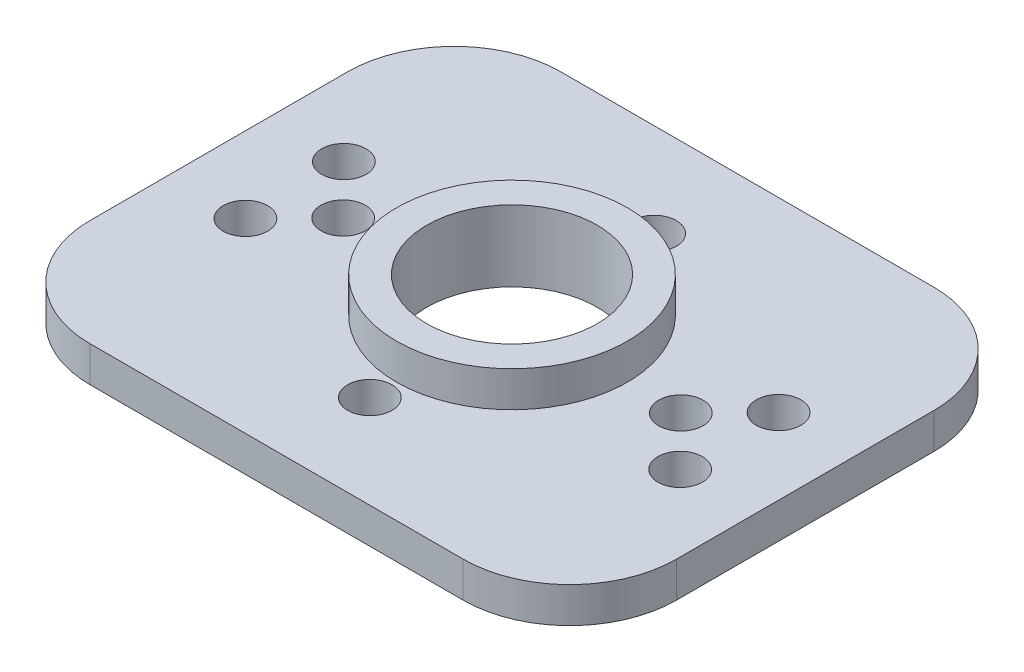
ISO-10303-21;
HEADER;
FILE_DESCRIPTION(('STEP AP214'),'2;1');
FILE_NAME('part.step','',(''),(''),'','','');
FILE_SCHEMA(('AUTOMOTIVE_DESIGN { 1 0 10303 214 1 1 1 1 }'));
ENDSEC;
DATA;
#1=APPLICATION_CONTEXT('core data for automotive mechanical design processes');
#2=APPLICATION_PROTOCOL_DEFINITION('international standard','automotive_design',2000,#1);
#3=PRODUCT_CONTEXT('',#1,'mechanical');
#4=PRODUCT('Part','Part','',(#3));
#5=PRODUCT_RELATED_PRODUCT_CATEGORY('part','',(#4));
#6=PRODUCT_DEFINITION_FORMATION('','',#4);
#7=PRODUCT_DEFINITION_CONTEXT('part definition',#1,'design');
#8=PRODUCT_DEFINITION('design','',#6,#7);
#9=PRODUCT_DEFINITION_SHAPE('','',#8);
#10=(LENGTH_UNIT() NAMED_UNIT(*) SI_UNIT(.MILLI.,.METRE.));
#11=(NAMED_UNIT(*) PLANE_ANGLE_UNIT() SI_UNIT($,.RADIAN.));
#12=(NAMED_UNIT(*) SI_UNIT($,.STERADIAN.) SOLID_ANGLE_UNIT());
#13=UNCERTAINTY_MEASURE_WITH_UNIT(LENGTH_MEASURE(1.E-05),#10,'distance_accuracy_value','');
#14=(GEOMETRIC_REPRESENTATION_CONTEXT(3) GLOBAL_UNCERTAINTY_ASSIGNED_CONTEXT((#13)) GLOBAL_UNIT_ASSIGNED_CONTEXT((#10,
#11,#12)) REPRESENTATION_CONTEXT('',''));
#15=CARTESIAN_POINT('',(0.,0.,0.));
#16=DIRECTION('',(0.,0.,1.));
#17=DIRECTION('',(1.,0.,0.));
#18=AXIS2_PLACEMENT_3D('',#15,#16,#17);
#19=CARTESIAN_POINT('',(-10.5,2.,7.24703162232863));
#20=DIRECTION('',(0.,-1.,0.));
#21=DIRECTION('',(0.,0.,-1.));
#22=AXIS2_PLACEMENT_3D('',#19,#20,#21);
#23=PLANE('',#22);
#24=CARTESIAN_POINT('',(12.23,2.,-2.77));
#25=DIRECTION('',(0.,1.,0.));
#26=DIRECTION('',(0.,0.,1.));
#27=AXIS2_PLACEMENT_3D('',#24,#25,#26);
#28=CIRCLE('',#27,1.25);
#29=CARTESIAN_POINT('',(12.23,2.,-1.52));
#30=VERTEX_POINT('',#29);
#31=EDGE_CURVE('E357',#30,#30,#28,.T.);
#32=ORIENTED_EDGE('',*,*,#31,.F.);
#33=EDGE_LOOP('',(#32));
#34=FACE_BOUND('',#33,.T.);
#35=CARTESIAN_POINT('',(12.23,2.,2.77));
#36=DIRECTION('',(0.,1.,0.));
#37=DIRECTION('',(0.,0.,1.));
#38=AXIS2_PLACEMENT_3D('',#35,#36,#37);
#39=CIRCLE('',#38,1.25);
#40=CARTESIAN_POINT('',(12.23,2.,4.02));
#41=VERTEX_POINT('',#40);
#42=EDGE_CURVE('E351',#41,#41,#39,.T.);
#43=ORIENTED_EDGE('',*,*,#42,.F.);
#44=EDGE_LOOP('',(#43));
#45=FACE_BOUND('',#44,.T.);
#46=CARTESIAN_POINT('',(-12.23,2.,2.77));
#47=DIRECTION('',(0.,1.,0.));
#48=DIRECTION('',(0.,0.,1.));
#49=AXIS2_PLACEMENT_3D('',#46,#47,#48);
#50=CIRCLE('',#49,1.25);
#51=CARTESIAN_POINT('',(-12.23,2.,4.02));
#52=VERTEX_POINT('',#51);
#53=EDGE_CURVE('E348',#52,#52,#50,.T.);
#54=ORIENTED_EDGE('',*,*,#53,.F.);
#55=EDGE_LOOP('',(#54));
#56=FACE_BOUND('',#55,.T.);
#57=CARTESIAN_POINT('',(-12.23,2.,-2.77));
#58=DIRECTION('',(0.,1.,0.));
#59=DIRECTION('',(0.,0.,1.));
#60=AXIS2_PLACEMENT_3D('',#57,#58,#59);
#61=CIRCLE('',#60,1.25);
#62=CARTESIAN_POINT('',(-12.23,2.,-1.52));
#63=VERTEX_POINT('',#62);
#64=EDGE_CURVE('E195',#63,#63,#61,.T.);
#65=ORIENTED_EDGE('',*,*,#64,.F.);
#66=EDGE_LOOP('',(#65));
#67=FACE_BOUND('',#66,.T.);
#68=CARTESIAN_POINT('',(9.5,2.,0.));
#69=DIRECTION('',(0.,1.,0.));
#70=DIRECTION('',(0.,0.,1.));
#71=AXIS2_PLACEMENT_3D('',#68,#69,#70);
#72=CIRCLE('',#71,1.25);
#73=CARTESIAN_POINT('',(9.5,2.,1.25));
#74=VERTEX_POINT('',#73);
#75=EDGE_CURVE('E225',#74,#74,#72,.T.);
#76=ORIENTED_EDGE('',*,*,#75,.F.);
#77=EDGE_LOOP('',(#76));
#78=FACE_BOUND('',#77,.T.);
#79=CARTESIAN_POINT('',(-9.5,2.,0.));
#80=DIRECTION('',(0.,1.,0.));
#81=DIRECTION('',(0.,0.,1.));
#82=AXIS2_PLACEMENT_3D('',#79,#80,#81);
#83=CIRCLE('',#82,1.25);
#84=CARTESIAN_POINT('',(-9.5,2.,1.25));
#85=VERTEX_POINT('',#84);
#86=EDGE_CURVE('E233',#85,#85,#83,.T.);
#87=ORIENTED_EDGE('',*,*,#86,.F.);
#88=EDGE_LOOP('',(#87));
#89=FACE_BOUND('',#88,.T.);
#90=CARTESIAN_POINT('',(0.,2.,8.));
#91=DIRECTION('',(0.,1.,0.));
#92=DIRECTION('',(0.,0.,1.));
#93=AXIS2_PLACEMENT_3D('',#90,#91,#92);
#94=CIRCLE('',#93,1.25);
#95=CARTESIAN_POINT('',(0.,2.,9.25));
#96=VERTEX_POINT('',#95);
#97=EDGE_CURVE('E241',#96,#96,#94,.T.);
#98=ORIENTED_EDGE('',*,*,#97,.F.);
#99=EDGE_LOOP('',(#98));
#100=FACE_BOUND('',#99,.T.);
#101=CARTESIAN_POINT('',(0.,2.,-8.));
#102=DIRECTION('',(0.,1.,0.));
#103=DIRECTION('',(0.,0.,1.));
#104=AXIS2_PLACEMENT_3D('',#101,#102,#103);
#105=CIRCLE('',#104,1.25);
#106=CARTESIAN_POINT('',(0.,2.,-6.75));
#107=VERTEX_POINT('',#106);
#108=EDGE_CURVE('E151',#107,#107,#105,.T.);
#109=ORIENTED_EDGE('',*,*,#108,.F.);
#110=EDGE_LOOP('',(#109));
#111=FACE_BOUND('',#110,.T.);
#112=CARTESIAN_POINT('',(-10.5,2.,7.24703162232863));
#113=DIRECTION('',(0.,1.,0.));
#114=DIRECTION('',(0.,0.,-1.));
#115=AXIS2_PLACEMENT_3D('',#112,#113,#114);
#116=CIRCLE('',#115,6.);
#117=CARTESIAN_POINT('',(-16.5,2.,7.24703162232859));
#118=VERTEX_POINT('',#117);
#119=CARTESIAN_POINT('',(-10.5,2.,13.2470316223286));
#120=VERTEX_POINT('',#119);
#121=EDGE_CURVE('E169',#118,#120,#116,.T.);
#122=ORIENTED_EDGE('',*,*,#121,.T.);
#123=DIRECTION('',(1.,0.,0.));
#124=VECTOR('',#123,1.);
#125=CARTESIAN_POINT('',(10.5,2.,13.2470316223286));
#126=LINE('',#125,#124);
#127=CARTESIAN_POINT('',(10.5,2.,13.2470316223286));
#128=VERTEX_POINT('',#127);
#129=EDGE_CURVE('E105',#120,#128,#126,.T.);
#130=ORIENTED_EDGE('',*,*,#129,.T.);
#131=CARTESIAN_POINT('',(10.5,2.,7.24703162232863));
#132=DIRECTION('',(0.,1.,0.));
#133=DIRECTION('',(0.,0.,1.));
#134=AXIS2_PLACEMENT_3D('',#131,#132,#133);
#135=CIRCLE('',#134,6.);
#136=CARTESIAN_POINT('',(16.5,2.,7.24703162232859));
#137=VERTEX_POINT('',#136);
#138=EDGE_CURVE('E259',#128,#137,#135,.T.);
#139=ORIENTED_EDGE('',*,*,#138,.T.);
#140=DIRECTION('',(0.,0.,-1.));
#141=VECTOR('',#140,1.);
#142=CARTESIAN_POINT('',(16.5,2.,7.24703162232859));
#143=LINE('',#142,#141);
#144=CARTESIAN_POINT('',(16.5,2.,-7.24703162232859));
#145=VERTEX_POINT('',#144);
#146=EDGE_CURVE('E262',#137,#145,#143,.T.);
#147=ORIENTED_EDGE('',*,*,#146,.T.);
#148=CARTESIAN_POINT('',(10.5,2.,-7.24703162232863));
#149=DIRECTION('',(0.,1.,0.));
#150=DIRECTION('',(0.,0.,-1.));
#151=AXIS2_PLACEMENT_3D('',#148,#149,#150);
#152=CIRCLE('',#151,6.);
#153=CARTESIAN_POINT('',(10.5,2.,-13.2470316223286));
#154=VERTEX_POINT('',#153);
#155=EDGE_CURVE('E124',#145,#154,#152,.T.);
#156=ORIENTED_EDGE('',*,*,#155,.T.);
#157=DIRECTION('',(-1.,0.,0.));
#158=VECTOR('',#157,1.);
#159=CARTESIAN_POINT('',(10.5,2.,-13.2470316223286));
#160=LINE('',#159,#158);
#161=CARTESIAN_POINT('',(-10.5,2.,-13.2470316223286));
#162=VERTEX_POINT('',#161);
#163=EDGE_CURVE('E118',#154,#162,#160,.T.);
#164=ORIENTED_EDGE('',*,*,#163,.T.);
#165=CARTESIAN_POINT('',(-10.5,2.,-7.24703162232863));
#166=DIRECTION('',(0.,1.,0.));
#167=DIRECTION('',(0.,0.,-1.));
#168=AXIS2_PLACEMENT_3D('',#165,#166,#167);
#169=CIRCLE('',#168,6.);
#170=CARTESIAN_POINT('',(-16.5,2.,-7.24703162232858));
#171=VERTEX_POINT('',#170);
#172=EDGE_CURVE('E122',#162,#171,#169,.T.);
#173=ORIENTED_EDGE('',*,*,#172,.T.);
#174=DIRECTION('',(0.,0.,1.));
#175=VECTOR('',#174,1.);
#176=CARTESIAN_POINT('',(-16.5,2.,7.24703162232859));
#177=LINE('',#176,#175);
#178=EDGE_CURVE('E61',#171,#118,#177,.T.);
#179=ORIENTED_EDGE('',*,*,#178,.T.);
#180=EDGE_LOOP('',(#122,#130,#139,#147,#156,#164,#173,#179));
#181=FACE_BOUND('',#180,.T.);
#182=CARTESIAN_POINT('',(0.,2.,0.));
#183=DIRECTION('',(0.,-1.,0.));
#184=DIRECTION('',(0.,0.,-1.));
#185=AXIS2_PLACEMENT_3D('',#182,#183,#184);
#186=CIRCLE('',#185,6.5);
#187=CARTESIAN_POINT('',(0.,2.,-6.5));
#188=VERTEX_POINT('',#187);
#189=EDGE_CURVE('E11',#188,#188,#186,.F.);
#190=ORIENTED_EDGE('',*,*,#189,.F.);
#191=EDGE_LOOP('',(#190));
#192=FACE_BOUND('',#191,.T.);
#193=ADVANCED_FACE('F41',(#34,#45,#56,#67,#78,#89,#100,#111,#181,#192),#23,.F.);
#194=CARTESIAN_POINT('',(-10.5,0.,7.24703162232863));
#195=DIRECTION('',(0.,-1.,0.));
#196=DIRECTION('',(0.,0.,-1.));
#197=AXIS2_PLACEMENT_3D('',#194,#195,#196);
#198=PLANE('',#197);
#199=CARTESIAN_POINT('',(12.23,0.,-2.77));
#200=DIRECTION('',(0.,-1.,0.));
#201=DIRECTION('',(0.,0.,-1.));
#202=AXIS2_PLACEMENT_3D('',#199,#200,#201);
#203=CIRCLE('',#202,1.25);
#204=CARTESIAN_POINT('',(12.23,0.,-4.02));
#205=VERTEX_POINT('',#204);
#206=EDGE_CURVE('E45',#205,#205,#203,.T.);
#207=ORIENTED_EDGE('',*,*,#206,.F.);
#208=EDGE_LOOP('',(#207));
#209=FACE_BOUND('',#208,.T.);
#210=CARTESIAN_POINT('',(12.23,0.,2.77));
#211=DIRECTION('',(0.,-1.,0.));
#212=DIRECTION('',(0.,0.,-1.));
#213=AXIS2_PLACEMENT_3D('',#210,#211,#212);
#214=CIRCLE('',#213,1.25);
#215=CARTESIAN_POINT('',(12.23,0.,1.52));
#216=VERTEX_POINT('',#215);
#217=EDGE_CURVE('E198',#216,#216,#214,.T.);
#218=ORIENTED_EDGE('',*,*,#217,.F.);
#219=EDGE_LOOP('',(#218));
#220=FACE_BOUND('',#219,.T.);
#221=CARTESIAN_POINT('',(-12.23,0.,2.77));
#222=DIRECTION('',(0.,-1.,0.));
#223=DIRECTION('',(0.,0.,-1.));
#224=AXIS2_PLACEMENT_3D('',#221,#222,#223);
#225=CIRCLE('',#224,1.25);
#226=CARTESIAN_POINT('',(-12.23,0.,1.52));
#227=VERTEX_POINT('',#226);
#228=EDGE_CURVE('E194',#227,#227,#225,.T.);
#229=ORIENTED_EDGE('',*,*,#228,.F.);
#230=EDGE_LOOP('',(#229));
#231=FACE_BOUND('',#230,.T.);
#232=CARTESIAN_POINT('',(-12.23,0.,-2.77));
#233=DIRECTION('',(0.,-1.,0.));
#234=DIRECTION('',(0.,0.,-1.));
#235=AXIS2_PLACEMENT_3D('',#232,#233,#234);
#236=CIRCLE('',#235,1.25);
#237=CARTESIAN_POINT('',(-12.23,0.,-4.02));
#238=VERTEX_POINT('',#237);
#239=EDGE_CURVE('E190',#238,#238,#236,.T.);
#240=ORIENTED_EDGE('',*,*,#239,.F.);
#241=EDGE_LOOP('',(#240));
#242=FACE_BOUND('',#241,.T.);
#243=CARTESIAN_POINT('',(9.5,0.,0.));
#244=DIRECTION('',(0.,1.,0.));
#245=DIRECTION('',(0.,0.,1.));
#246=AXIS2_PLACEMENT_3D('',#243,#244,#245);
#247=CIRCLE('',#246,1.25);
#248=CARTESIAN_POINT('',(9.5,0.,1.25));
#249=VERTEX_POINT('',#248);
#250=EDGE_CURVE('E224',#249,#249,#247,.T.);
#251=ORIENTED_EDGE('',*,*,#250,.T.);
#252=EDGE_LOOP('',(#251));
#253=FACE_BOUND('',#252,.T.);
#254=CARTESIAN_POINT('',(0.,0.,8.));
#255=DIRECTION('',(0.,1.,0.));
#256=DIRECTION('',(0.,0.,1.));
#257=AXIS2_PLACEMENT_3D('',#254,#255,#256);
#258=CIRCLE('',#257,1.25);
#259=CARTESIAN_POINT('',(0.,0.,9.25));
#260=VERTEX_POINT('',#259);
#261=EDGE_CURVE('E237',#260,#260,#258,.T.);
#262=ORIENTED_EDGE('',*,*,#261,.T.);
#263=EDGE_LOOP('',(#262));
#264=FACE_BOUND('',#263,.T.);
#265=CARTESIAN_POINT('',(-10.5,0.,7.24703162232863));
#266=DIRECTION('',(0.,1.,0.));
#267=DIRECTION('',(0.,0.,-1.));
#268=AXIS2_PLACEMENT_3D('',#265,#266,#267);
#269=CIRCLE('',#268,6.);
#270=CARTESIAN_POINT('',(-16.5,0.,7.24703162232859));
#271=VERTEX_POINT('',#270);
#272=CARTESIAN_POINT('',(-10.5,0.,13.2470316223286));
#273=VERTEX_POINT('',#272);
#274=EDGE_CURVE('E146',#271,#273,#269,.T.);
#275=ORIENTED_EDGE('',*,*,#274,.F.);
#276=DIRECTION('',(0.,0.,1.));
#277=VECTOR('',#276,1.);
#278=CARTESIAN_POINT('',(-16.5,0.,7.24703162232859));
#279=LINE('',#278,#277);
#280=CARTESIAN_POINT('',(-16.5,0.,-7.24703162232858));
#281=VERTEX_POINT('',#280);
#282=EDGE_CURVE('E96',#281,#271,#279,.T.);
#283=ORIENTED_EDGE('',*,*,#282,.F.);
#284=CARTESIAN_POINT('',(-10.5,0.,-7.24703162232863));
#285=DIRECTION('',(0.,1.,0.));
#286=DIRECTION('',(0.,0.,-1.));
#287=AXIS2_PLACEMENT_3D('',#284,#285,#286);
#288=CIRCLE('',#287,6.);
#289=CARTESIAN_POINT('',(-10.5,0.,-13.2470316223286));
#290=VERTEX_POINT('',#289);
#291=EDGE_CURVE('E90',#290,#281,#288,.T.);
#292=ORIENTED_EDGE('',*,*,#291,.F.);
#293=DIRECTION('',(-1.,0.,0.));
#294=VECTOR('',#293,1.);
#295=CARTESIAN_POINT('',(10.5,0.,-13.2470316223286));
#296=LINE('',#295,#294);
#297=CARTESIAN_POINT('',(10.5,0.,-13.2470316223286));
#298=VERTEX_POINT('',#297);
#299=EDGE_CURVE('E133',#298,#290,#296,.T.);
#300=ORIENTED_EDGE('',*,*,#299,.F.);
#301=CARTESIAN_POINT('',(10.5,0.,-7.24703162232863));
#302=DIRECTION('',(0.,1.,0.));
#303=DIRECTION('',(0.,0.,-1.));
#304=AXIS2_PLACEMENT_3D('',#301,#302,#303);
#305=CIRCLE('',#304,6.);
#306=CARTESIAN_POINT('',(16.5,0.,-7.24703162232859));
#307=VERTEX_POINT('',#306);
#308=EDGE_CURVE('E160',#307,#298,#305,.T.);
#309=ORIENTED_EDGE('',*,*,#308,.F.);
#310=DIRECTION('',(0.,0.,-1.));
#311=VECTOR('',#310,1.);
#312=CARTESIAN_POINT('',(16.5,0.,7.24703162232859));
#313=LINE('',#312,#311);
#314=CARTESIAN_POINT('',(16.5,0.,7.24703162232859));
#315=VERTEX_POINT('',#314);
#316=EDGE_CURVE('E157',#315,#307,#313,.T.);
#317=ORIENTED_EDGE('',*,*,#316,.F.);
#318=CARTESIAN_POINT('',(10.5,0.,7.24703162232863));
#319=DIRECTION('',(0.,1.,0.));
#320=DIRECTION('',(0.,0.,1.));
#321=AXIS2_PLACEMENT_3D('',#318,#319,#320);
#322=CIRCLE('',#321,6.);
#323=CARTESIAN_POINT('',(10.5,0.,13.2470316223286));
#324=VERTEX_POINT('',#323);
#325=EDGE_CURVE('E154',#324,#315,#322,.T.);
#326=ORIENTED_EDGE('',*,*,#325,.F.);
#327=DIRECTION('',(1.,0.,0.));
#328=VECTOR('',#327,1.);
#329=CARTESIAN_POINT('',(10.5,0.,13.2470316223286));
#330=LINE('',#329,#328);
#331=EDGE_CURVE('E150',#273,#324,#330,.T.);
#332=ORIENTED_EDGE('',*,*,#331,.F.);
#333=EDGE_LOOP('',(#275,#283,#292,#300,#309,#317,#326,#332));
#334=FACE_BOUND('',#333,.T.);
#335=CARTESIAN_POINT('',(0.,0.,-8.));
#336=DIRECTION('',(0.,1.,0.));
#337=DIRECTION('',(0.,0.,1.));
#338=AXIS2_PLACEMENT_3D('',#335,#336,#337);
#339=CIRCLE('',#338,1.25);
#340=CARTESIAN_POINT('',(0.,0.,-6.75));
#341=VERTEX_POINT('',#340);
#342=EDGE_CURVE('E245',#341,#341,#339,.T.);
#343=ORIENTED_EDGE('',*,*,#342,.T.);
#344=EDGE_LOOP('',(#343));
#345=FACE_BOUND('',#344,.T.);
#346=CARTESIAN_POINT('',(-9.5,0.,0.));
#347=DIRECTION('',(0.,1.,0.));
#348=DIRECTION('',(0.,0.,1.));
#349=AXIS2_PLACEMENT_3D('',#346,#347,#348);
#350=CIRCLE('',#349,1.25);
#351=CARTESIAN_POINT('',(-9.5,0.,1.25));
#352=VERTEX_POINT('',#351);
#353=EDGE_CURVE('E229',#352,#352,#350,.T.);
#354=ORIENTED_EDGE('',*,*,#353,.T.);
#355=EDGE_LOOP('',(#354));
#356=FACE_BOUND('',#355,.T.);
#357=CARTESIAN_POINT('',(0.,0.,0.));
#358=DIRECTION('',(0.,1.,0.));
#359=DIRECTION('',(0.,0.,1.));
#360=AXIS2_PLACEMENT_3D('',#357,#358,#359);
#361=CIRCLE('',#360,4.8);
#362=CARTESIAN_POINT('',(0.,0.,4.8));
#363=VERTEX_POINT('',#362);
#364=EDGE_CURVE('E216',#363,#363,#361,.T.);
#365=ORIENTED_EDGE('',*,*,#364,.T.);
#366=EDGE_LOOP('',(#365));
#367=FACE_BOUND('',#366,.T.);
#368=ADVANCED_FACE('F277',(#209,#220,#231,#242,#253,#264,#334,#345,#356,#367),#198,.T.);
#369=CARTESIAN_POINT('',(-10.5,2.,7.24703162232863));
#370=DIRECTION('',(0.,-1.,0.));
#371=DIRECTION('',(0.,0.,-1.));
#372=AXIS2_PLACEMENT_3D('',#369,#370,#371);
#373=CYLINDRICAL_SURFACE('',#372,6.);
#374=ORIENTED_EDGE('',*,*,#274,.T.);
#375=DIRECTION('',(0.,-1.,0.));
#376=VECTOR('',#375,1.);
#377=CARTESIAN_POINT('',(-10.5,2.,13.2470316223286));
#378=LINE('',#377,#376);
#379=EDGE_CURVE('E52',#120,#273,#378,.T.);
#380=ORIENTED_EDGE('',*,*,#379,.F.);
#381=ORIENTED_EDGE('',*,*,#121,.F.);
#382=DIRECTION('',(0.,-1.,0.));
#383=VECTOR('',#382,1.);
#384=CARTESIAN_POINT('',(-16.5,2.,7.24703162232859));
#385=LINE('',#384,#383);
#386=EDGE_CURVE('E142',#118,#271,#385,.T.);
#387=ORIENTED_EDGE('',*,*,#386,.T.);
#388=EDGE_LOOP('',(#374,#380,#381,#387));
#389=FACE_BOUND('',#388,.T.);
#390=ADVANCED_FACE('F43',(#389),#373,.T.);
#391=CARTESIAN_POINT('',(10.5,2.,13.2470316223286));
#392=DIRECTION('',(0.,0.,-1.));
#393=DIRECTION('',(-1.,0.,0.));
#394=AXIS2_PLACEMENT_3D('',#391,#392,#393);
#395=PLANE('',#394);
#396=ORIENTED_EDGE('',*,*,#331,.T.);
#397=DIRECTION('',(0.,-1.,0.));
#398=VECTOR('',#397,1.);
#399=CARTESIAN_POINT('',(10.5,2.,13.2470316223286));
#400=LINE('',#399,#398);
#401=EDGE_CURVE('E184',#128,#324,#400,.T.);
#402=ORIENTED_EDGE('',*,*,#401,.F.);
#403=ORIENTED_EDGE('',*,*,#129,.F.);
#404=ORIENTED_EDGE('',*,*,#379,.T.);
#405=EDGE_LOOP('',(#396,#402,#403,#404));
#406=FACE_BOUND('',#405,.T.);
#407=ADVANCED_FACE('F448',(#406),#395,.F.);
#408=CARTESIAN_POINT('',(10.5,2.,7.24703162232863));
#409=DIRECTION('',(0.,-1.,0.));
#410=DIRECTION('',(0.,0.,-1.));
#411=AXIS2_PLACEMENT_3D('',#408,#409,#410);
#412=CYLINDRICAL_SURFACE('',#411,6.);
#413=ORIENTED_EDGE('',*,*,#325,.T.);
#414=DIRECTION('',(0.,-1.,0.));
#415=VECTOR('',#414,1.);
#416=CARTESIAN_POINT('',(16.5,2.,7.24703162232859));
#417=LINE('',#416,#415);
#418=EDGE_CURVE('E180',#137,#315,#417,.T.);
#419=ORIENTED_EDGE('',*,*,#418,.F.);
#420=ORIENTED_EDGE('',*,*,#138,.F.);
#421=ORIENTED_EDGE('',*,*,#401,.T.);
#422=EDGE_LOOP('',(#413,#419,#420,#421));
#423=FACE_BOUND('',#422,.T.);
#424=ADVANCED_FACE('F453',(#423),#412,.T.);
#425=CARTESIAN_POINT('',(16.5,2.,7.24703162232859));
#426=DIRECTION('',(-1.,0.,0.));
#427=DIRECTION('',(0.,0.,1.));
#428=AXIS2_PLACEMENT_3D('',#425,#426,#427);
#429=PLANE('',#428);
#430=ORIENTED_EDGE('',*,*,#316,.T.);
#431=DIRECTION('',(0.,-1.,0.));
#432=VECTOR('',#431,1.);
#433=CARTESIAN_POINT('',(16.5,2.,-7.24703162232859));
#434=LINE('',#433,#432);
#435=EDGE_CURVE('E176',#145,#307,#434,.T.);
#436=ORIENTED_EDGE('',*,*,#435,.F.);
#437=ORIENTED_EDGE('',*,*,#146,.F.);
#438=ORIENTED_EDGE('',*,*,#418,.T.);
#439=EDGE_LOOP('',(#430,#436,#437,#438));
#440=FACE_BOUND('',#439,.T.);
#441=ADVANCED_FACE('F270',(#440),#429,.F.);
#442=CARTESIAN_POINT('',(10.5,2.,-7.24703162232863));
#443=DIRECTION('',(0.,-1.,0.));
#444=DIRECTION('',(0.,0.,-1.));
#445=AXIS2_PLACEMENT_3D('',#442,#443,#444);
#446=CYLINDRICAL_SURFACE('',#445,6.);
#447=ORIENTED_EDGE('',*,*,#308,.T.);
#448=DIRECTION('',(0.,-1.,0.));
#449=VECTOR('',#448,1.);
#450=CARTESIAN_POINT('',(10.5,2.,-13.2470316223286));
#451=LINE('',#450,#449);
#452=EDGE_CURVE('E135',#154,#298,#451,.T.);
#453=ORIENTED_EDGE('',*,*,#452,.F.);
#454=ORIENTED_EDGE('',*,*,#155,.F.);
#455=ORIENTED_EDGE('',*,*,#435,.T.);
#456=EDGE_LOOP('',(#447,#453,#454,#455));
#457=FACE_BOUND('',#456,.T.);
#458=ADVANCED_FACE('F274',(#457),#446,.T.);
#459=CARTESIAN_POINT('',(10.5,2.,-13.2470316223286));
#460=DIRECTION('',(0.,0.,1.));
#461=DIRECTION('',(1.,0.,0.));
#462=AXIS2_PLACEMENT_3D('',#459,#460,#461);
#463=PLANE('',#462);
#464=ORIENTED_EDGE('',*,*,#299,.T.);
#465=DIRECTION('',(0.,-1.,0.));
#466=VECTOR('',#465,1.);
#467=CARTESIAN_POINT('',(-10.5,2.,-13.2470316223286));
#468=LINE('',#467,#466);
#469=EDGE_CURVE('E130',#162,#290,#468,.T.);
#470=ORIENTED_EDGE('',*,*,#469,.F.);
#471=ORIENTED_EDGE('',*,*,#163,.F.);
#472=ORIENTED_EDGE('',*,*,#452,.T.);
#473=EDGE_LOOP('',(#464,#470,#471,#472));
#474=FACE_BOUND('',#473,.T.);
#475=ADVANCED_FACE('F131',(#474),#463,.F.);
#476=CARTESIAN_POINT('',(-10.5,2.,-7.24703162232863));
#477=DIRECTION('',(0.,-1.,0.));
#478=DIRECTION('',(0.,0.,-1.));
#479=AXIS2_PLACEMENT_3D('',#476,#477,#478);
#480=CYLINDRICAL_SURFACE('',#479,6.);
#481=ORIENTED_EDGE('',*,*,#291,.T.);
#482=DIRECTION('',(0.,-1.,0.));
#483=VECTOR('',#482,1.);
#484=CARTESIAN_POINT('',(-16.5,2.,-7.24703162232858));
#485=LINE('',#484,#483);
#486=EDGE_CURVE('E136',#171,#281,#485,.T.);
#487=ORIENTED_EDGE('',*,*,#486,.F.);
#488=ORIENTED_EDGE('',*,*,#172,.F.);
#489=ORIENTED_EDGE('',*,*,#469,.T.);
#490=EDGE_LOOP('',(#481,#487,#488,#489));
#491=FACE_BOUND('',#490,.T.);
#492=ADVANCED_FACE('F138',(#491),#480,.T.);
#493=CARTESIAN_POINT('',(-16.5,2.,7.24703162232859));
#494=DIRECTION('',(1.,0.,0.));
#495=DIRECTION('',(0.,0.,-1.));
#496=AXIS2_PLACEMENT_3D('',#493,#494,#495);
#497=PLANE('',#496);
#498=ORIENTED_EDGE('',*,*,#282,.T.);
#499=ORIENTED_EDGE('',*,*,#386,.F.);
#500=ORIENTED_EDGE('',*,*,#178,.F.);
#501=ORIENTED_EDGE('',*,*,#486,.T.);
#502=EDGE_LOOP('',(#498,#499,#500,#501));
#503=FACE_BOUND('',#502,.T.);
#504=ADVANCED_FACE('F283',(#503),#497,.F.);
#505=CARTESIAN_POINT('',(0.,2.,-8.));
#506=DIRECTION('',(0.,-1.,0.));
#507=DIRECTION('',(0.,0.,-1.));
#508=AXIS2_PLACEMENT_3D('',#505,#506,#507);
#509=CYLINDRICAL_SURFACE('',#508,1.25);
#510=ORIENTED_EDGE('',*,*,#108,.T.);
#511=EDGE_LOOP('',(#510));
#512=FACE_BOUND('',#511,.T.);
#513=ORIENTED_EDGE('',*,*,#342,.F.);
#514=EDGE_LOOP('',(#513));
#515=FACE_BOUND('',#514,.T.);
#516=ADVANCED_FACE('F285',(#512,#515),#509,.F.);
#517=CARTESIAN_POINT('',(0.,2.,8.));
#518=DIRECTION('',(0.,-1.,0.));
#519=DIRECTION('',(0.,0.,-1.));
#520=AXIS2_PLACEMENT_3D('',#517,#518,#519);
#521=CYLINDRICAL_SURFACE('',#520,1.25);
#522=ORIENTED_EDGE('',*,*,#97,.T.);
#523=EDGE_LOOP('',(#522));
#524=FACE_BOUND('',#523,.T.);
#525=ORIENTED_EDGE('',*,*,#261,.F.);
#526=EDGE_LOOP('',(#525));
#527=FACE_BOUND('',#526,.T.);
#528=ADVANCED_FACE('F291',(#524,#527),#521,.F.);
#529=CARTESIAN_POINT('',(-9.5,2.,0.));
#530=DIRECTION('',(0.,-1.,0.));
#531=DIRECTION('',(0.,0.,-1.));
#532=AXIS2_PLACEMENT_3D('',#529,#530,#531);
#533=CYLINDRICAL_SURFACE('',#532,1.25);
#534=ORIENTED_EDGE('',*,*,#86,.T.);
#535=EDGE_LOOP('',(#534));
#536=FACE_BOUND('',#535,.T.);
#537=ORIENTED_EDGE('',*,*,#353,.F.);
#538=EDGE_LOOP('',(#537));
#539=FACE_BOUND('',#538,.T.);
#540=ADVANCED_FACE('F308',(#536,#539),#533,.F.);
#541=CARTESIAN_POINT('',(9.5,2.,0.));
#542=DIRECTION('',(0.,-1.,0.));
#543=DIRECTION('',(0.,0.,-1.));
#544=AXIS2_PLACEMENT_3D('',#541,#542,#543);
#545=CYLINDRICAL_SURFACE('',#544,1.25);
#546=ORIENTED_EDGE('',*,*,#75,.T.);
#547=EDGE_LOOP('',(#546));
#548=FACE_BOUND('',#547,.T.);
#549=ORIENTED_EDGE('',*,*,#250,.F.);
#550=EDGE_LOOP('',(#549));
#551=FACE_BOUND('',#550,.T.);
#552=ADVANCED_FACE('F312',(#548,#551),#545,.F.);
#553=CARTESIAN_POINT('',(0.,2.,0.));
#554=DIRECTION('',(0.,-1.,0.));
#555=DIRECTION('',(0.,0.,-1.));
#556=AXIS2_PLACEMENT_3D('',#553,#554,#555);
#557=CYLINDRICAL_SURFACE('',#556,4.8);
#558=ORIENTED_EDGE('',*,*,#364,.F.);
#559=EDGE_LOOP('',(#558));
#560=FACE_BOUND('',#559,.T.);
#561=CARTESIAN_POINT('',(0.,4.,0.));
#562=DIRECTION('',(0.,1.,0.));
#563=DIRECTION('',(0.,0.,1.));
#564=AXIS2_PLACEMENT_3D('',#561,#562,#563);
#565=CIRCLE('',#564,4.8);
#566=CARTESIAN_POINT('',(0.,4.,4.8));
#567=VERTEX_POINT('',#566);
#568=EDGE_CURVE('E205',#567,#567,#565,.T.);
#569=ORIENTED_EDGE('',*,*,#568,.T.);
#570=EDGE_LOOP('',(#569));
#571=FACE_BOUND('',#570,.T.);
#572=ADVANCED_FACE('F316',(#560,#571),#557,.F.);
#573=CARTESIAN_POINT('',(0.,4.,0.));
#574=DIRECTION('',(0.,1.,0.));
#575=DIRECTION('',(0.,0.,1.));
#576=AXIS2_PLACEMENT_3D('',#573,#574,#575);
#577=PLANE('',#576);
#578=CARTESIAN_POINT('',(0.,4.,0.));
#579=DIRECTION('',(0.,1.,0.));
#580=DIRECTION('',(0.,0.,1.));
#581=AXIS2_PLACEMENT_3D('',#578,#579,#580);
#582=CIRCLE('',#581,6.5);
#583=CARTESIAN_POINT('',(0.,4.,6.5));
#584=VERTEX_POINT('',#583);
#585=EDGE_CURVE('E210',#584,#584,#582,.T.);
#586=ORIENTED_EDGE('',*,*,#585,.T.);
#587=EDGE_LOOP('',(#586));
#588=FACE_BOUND('',#587,.T.);
#589=ORIENTED_EDGE('',*,*,#568,.F.);
#590=EDGE_LOOP('',(#589));
#591=FACE_BOUND('',#590,.T.);
#592=ADVANCED_FACE('F320',(#588,#591),#577,.T.);
#593=CARTESIAN_POINT('',(0.,4.,0.));
#594=DIRECTION('',(0.,-1.,0.));
#595=DIRECTION('',(0.,0.,-1.));
#596=AXIS2_PLACEMENT_3D('',#593,#594,#595);
#597=CYLINDRICAL_SURFACE('',#596,6.5);
#598=ORIENTED_EDGE('',*,*,#585,.F.);
#599=EDGE_LOOP('',(#598));
#600=FACE_BOUND('',#599,.T.);
#601=ORIENTED_EDGE('',*,*,#189,.T.);
#602=EDGE_LOOP('',(#601));
#603=FACE_BOUND('',#602,.T.);
#604=ADVANCED_FACE('F322',(#600,#603),#597,.T.);
#605=CARTESIAN_POINT('',(-12.23,-8.,-2.77));
#606=DIRECTION('',(0.,1.,0.));
#607=DIRECTION('',(0.,0.,1.));
#608=AXIS2_PLACEMENT_3D('',#605,#606,#607);
#609=CYLINDRICAL_SURFACE('',#608,1.25);
#610=ORIENTED_EDGE('',*,*,#239,.T.);
#611=EDGE_LOOP('',(#610));
#612=FACE_BOUND('',#611,.T.);
#613=ORIENTED_EDGE('',*,*,#64,.T.);
#614=EDGE_LOOP('',(#613));
#615=FACE_BOUND('',#614,.T.);
#616=ADVANCED_FACE('F325',(#612,#615),#609,.F.);
#617=CARTESIAN_POINT('',(-12.23,-8.,2.77));
#618=DIRECTION('',(0.,1.,0.));
#619=DIRECTION('',(0.,0.,1.));
#620=AXIS2_PLACEMENT_3D('',#617,#618,#619);
#621=CYLINDRICAL_SURFACE('',#620,1.25);
#622=ORIENTED_EDGE('',*,*,#228,.T.);
#623=EDGE_LOOP('',(#622));
#624=FACE_BOUND('',#623,.T.);
#625=ORIENTED_EDGE('',*,*,#53,.T.);
#626=EDGE_LOOP('',(#625));
#627=FACE_BOUND('',#626,.T.);
#628=ADVANCED_FACE('F332',(#624,#627),#621,.F.);
#629=CARTESIAN_POINT('',(12.23,-8.,2.77));
#630=DIRECTION('',(0.,1.,0.));
#631=DIRECTION('',(0.,0.,1.));
#632=AXIS2_PLACEMENT_3D('',#629,#630,#631);
#633=CYLINDRICAL_SURFACE('',#632,1.25);
#634=ORIENTED_EDGE('',*,*,#217,.T.);
#635=EDGE_LOOP('',(#634));
#636=FACE_BOUND('',#635,.T.);
#637=ORIENTED_EDGE('',*,*,#42,.T.);
#638=EDGE_LOOP('',(#637));
#639=FACE_BOUND('',#638,.T.);
#640=ADVANCED_FACE('F337',(#636,#639),#633,.F.);
#641=CARTESIAN_POINT('',(12.23,-8.,-2.77));
#642=DIRECTION('',(0.,1.,0.));
#643=DIRECTION('',(0.,0.,1.));
#644=AXIS2_PLACEMENT_3D('',#641,#642,#643);
#645=CYLINDRICAL_SURFACE('',#644,1.25);
#646=ORIENTED_EDGE('',*,*,#206,.T.);
#647=EDGE_LOOP('',(#646));
#648=FACE_BOUND('',#647,.T.);
#649=ORIENTED_EDGE('',*,*,#31,.T.);
#650=EDGE_LOOP('',(#649));
#651=FACE_BOUND('',#650,.T.);
#652=ADVANCED_FACE('F334',(#648,#651),#645,.F.);
#653=CLOSED_SHELL('',(#193,#368,#390,#407,#424,#441,#458,#475,#492,#504,#516,#528,#540,#552,
#572,#592,#604,#616,#628,#640,#652));
#654=MANIFOLD_SOLID_BREP('B2',#653);
#655=ADVANCED_BREP_SHAPE_REPRESENTATION('',(#18,#654),#14);
#656=SHAPE_DEFINITION_REPRESENTATION(#9,#655);
ENDSEC;
END-ISO-10303-21;
